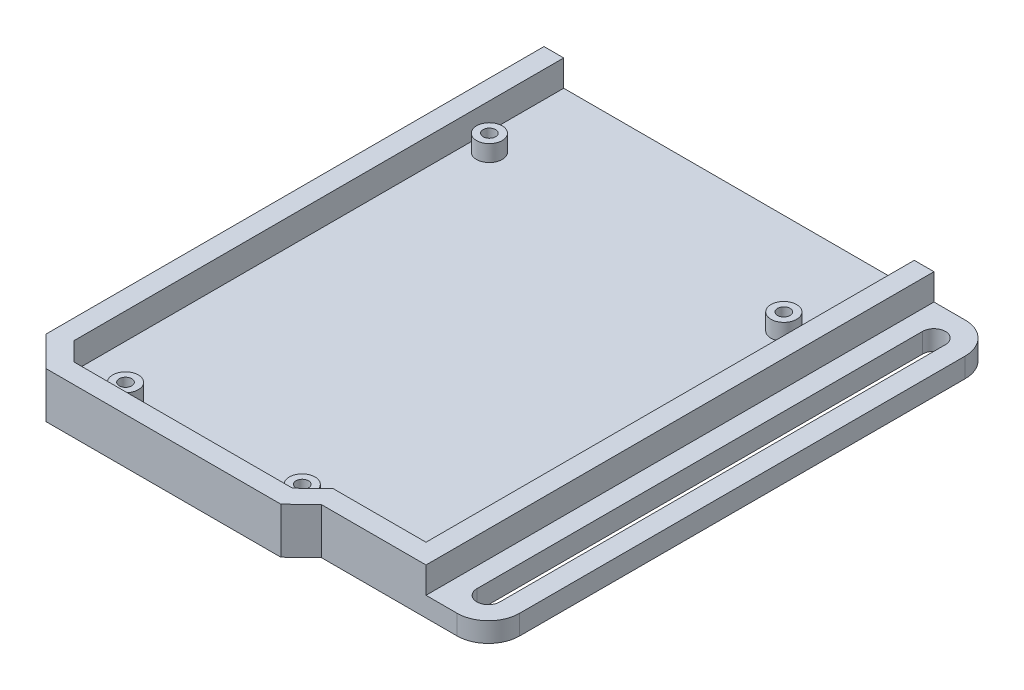
ISO-10303-21;
HEADER;
FILE_DESCRIPTION(('STEP AP214'),'2;1');
FILE_NAME('part.step','',(''),(''),'','','');
FILE_SCHEMA(('AUTOMOTIVE_DESIGN { 1 0 10303 214 1 1 1 1 }'));
ENDSEC;
DATA;
#1=APPLICATION_CONTEXT('core data for automotive mechanical design processes');
#2=APPLICATION_PROTOCOL_DEFINITION('international standard','automotive_design',2000,#1);
#3=PRODUCT_CONTEXT('',#1,'mechanical');
#4=PRODUCT('Part','Part','',(#3));
#5=PRODUCT_RELATED_PRODUCT_CATEGORY('part','',(#4));
#6=PRODUCT_DEFINITION_FORMATION('','',#4);
#7=PRODUCT_DEFINITION_CONTEXT('part definition',#1,'design');
#8=PRODUCT_DEFINITION('design','',#6,#7);
#9=PRODUCT_DEFINITION_SHAPE('','',#8);
#10=(LENGTH_UNIT() NAMED_UNIT(*) SI_UNIT(.MILLI.,.METRE.));
#11=(NAMED_UNIT(*) PLANE_ANGLE_UNIT() SI_UNIT($,.RADIAN.));
#12=(NAMED_UNIT(*) SI_UNIT($,.STERADIAN.) SOLID_ANGLE_UNIT());
#13=UNCERTAINTY_MEASURE_WITH_UNIT(LENGTH_MEASURE(1.E-05),#10,'distance_accuracy_value','');
#14=(GEOMETRIC_REPRESENTATION_CONTEXT(3) GLOBAL_UNCERTAINTY_ASSIGNED_CONTEXT((#13)) GLOBAL_UNIT_ASSIGNED_CONTEXT((#10,
#11,#12)) REPRESENTATION_CONTEXT('',''));
#15=CARTESIAN_POINT('',(0.,0.,0.));
#16=DIRECTION('',(0.,0.,1.));
#17=DIRECTION('',(1.,0.,0.));
#18=AXIS2_PLACEMENT_3D('',#15,#16,#17);
#19=CARTESIAN_POINT('',(0.,3.,0.));
#20=DIRECTION('',(0.,1.,0.));
#21=DIRECTION('',(0.,0.,1.));
#22=AXIS2_PLACEMENT_3D('',#19,#20,#21);
#23=PLANE('',#22);
#24=CARTESIAN_POINT('',(5.76671842937487,3.,14.088511522411));
#25=DIRECTION('',(0.,1.,0.));
#26=DIRECTION('',(0.,0.,1.));
#27=AXIS2_PLACEMENT_3D('',#24,#25,#26);
#28=CIRCLE('',#27,1.95);
#29=CARTESIAN_POINT('',(5.76671842937487,3.,16.038511522411));
#30=VERTEX_POINT('',#29);
#31=EDGE_CURVE('E813',#30,#30,#28,.T.);
#32=ORIENTED_EDGE('',*,*,#31,.F.);
#33=EDGE_LOOP('',(#32));
#34=FACE_BOUND('',#33,.T.);
#35=CARTESIAN_POINT('',(51.762416691101,3.,15.240864439478));
#36=DIRECTION('',(0.,1.,0.));
#37=DIRECTION('',(0.,0.,1.));
#38=AXIS2_PLACEMENT_3D('',#35,#36,#37);
#39=CIRCLE('',#38,1.95);
#40=CARTESIAN_POINT('',(51.762416691101,3.,17.190864439478));
#41=VERTEX_POINT('',#40);
#42=EDGE_CURVE('E819',#41,#41,#39,.T.);
#43=ORIENTED_EDGE('',*,*,#42,.F.);
#44=EDGE_LOOP('',(#43));
#45=FACE_BOUND('',#44,.T.);
#46=CARTESIAN_POINT('',(37.8269628301836,3.,74.6531691166795));
#47=DIRECTION('',(0.,1.,0.));
#48=DIRECTION('',(0.,0.,1.));
#49=AXIS2_PLACEMENT_3D('',#46,#47,#48);
#50=CIRCLE('',#49,1.95);
#51=CARTESIAN_POINT('',(37.8269628301836,3.,76.6031691166795));
#52=VERTEX_POINT('',#51);
#53=EDGE_CURVE('E830',#52,#52,#50,.T.);
#54=ORIENTED_EDGE('',*,*,#53,.F.);
#55=EDGE_LOOP('',(#54));
#56=FACE_BOUND('',#55,.T.);
#57=CARTESIAN_POINT('',(10.9124443508022,3.,74.6531691166795));
#58=DIRECTION('',(0.,1.,0.));
#59=DIRECTION('',(0.,0.,1.));
#60=AXIS2_PLACEMENT_3D('',#57,#58,#59);
#61=CIRCLE('',#60,1.95);
#62=CARTESIAN_POINT('',(10.9124443508022,3.,76.6031691166795));
#63=VERTEX_POINT('',#62);
#64=EDGE_CURVE('E838',#63,#63,#61,.T.);
#65=ORIENTED_EDGE('',*,*,#64,.F.);
#66=EDGE_LOOP('',(#65));
#67=FACE_BOUND('',#66,.T.);
#68=DIRECTION('',(0.,0.,-1.));
#69=VECTOR('',#68,1.);
#70=CARTESIAN_POINT('',(3.,3.,0.));
#71=LINE('',#70,#69);
#72=CARTESIAN_POINT('',(3.,3.,74.6072713686411));
#73=VERTEX_POINT('',#72);
#74=CARTESIAN_POINT('',(3.,3.,0.));
#75=VERTEX_POINT('',#74);
#76=EDGE_CURVE('E56',#73,#75,#71,.T.);
#77=ORIENTED_EDGE('',*,*,#76,.F.);
#78=DIRECTION('',(-0.707106781186547,0.,-0.707106781186548));
#79=VECTOR('',#78,1.);
#80=CARTESIAN_POINT('',(3.,3.,74.6072713686411));
#81=LINE('',#80,#79);
#82=CARTESIAN_POINT('',(5.79289321881343,3.,77.4001645874545));
#83=VERTEX_POINT('',#82);
#84=EDGE_CURVE('E60',#83,#73,#81,.T.);
#85=ORIENTED_EDGE('',*,*,#84,.F.);
#86=DIRECTION('',(-1.,0.,0.));
#87=VECTOR('',#86,1.);
#88=CARTESIAN_POINT('',(5.79289321881343,3.,77.4001645874545));
#89=LINE('',#88,#87);
#90=CARTESIAN_POINT('',(39.1023549197021,3.,77.4001645874545));
#91=VERTEX_POINT('',#90);
#92=EDGE_CURVE('E259',#91,#83,#89,.T.);
#93=ORIENTED_EDGE('',*,*,#92,.F.);
#94=DIRECTION('',(-0.720784855828902,0.,0.693158850197924));
#95=VECTOR('',#94,1.);
#96=CARTESIAN_POINT('',(39.1023549197021,3.,77.4001645874545));
#97=LINE('',#96,#95);
#98=CARTESIAN_POINT('',(42.2577150828608,3.,74.3657420340836));
#99=VERTEX_POINT('',#98);
#100=EDGE_CURVE('E256',#99,#91,#97,.T.);
#101=ORIENTED_EDGE('',*,*,#100,.F.);
#102=DIRECTION('',(-1.,0.,0.));
#103=VECTOR('',#102,1.);
#104=CARTESIAN_POINT('',(42.2577150828608,3.,74.3657420340836));
#105=LINE('',#104,#103);
#106=CARTESIAN_POINT('',(56.3910478037337,3.,74.3657420340836));
#107=VERTEX_POINT('',#106);
#108=EDGE_CURVE('E253',#107,#99,#105,.T.);
#109=ORIENTED_EDGE('',*,*,#108,.F.);
#110=DIRECTION('',(0.,0.,1.));
#111=VECTOR('',#110,1.);
#112=CARTESIAN_POINT('',(56.3910478037337,3.,74.3657420340836));
#113=LINE('',#112,#111);
#114=CARTESIAN_POINT('',(56.3910478037337,3.,0.));
#115=VERTEX_POINT('',#114);
#116=EDGE_CURVE('E249',#115,#107,#113,.T.);
#117=ORIENTED_EDGE('',*,*,#116,.F.);
#118=DIRECTION('',(-1.,0.,0.));
#119=VECTOR('',#118,1.);
#120=CARTESIAN_POINT('',(0.,3.,0.));
#121=LINE('',#120,#119);
#122=EDGE_CURVE('E298',#115,#75,#121,.T.);
#123=ORIENTED_EDGE('',*,*,#122,.T.);
#124=EDGE_LOOP('',(#77,#85,#93,#101,#109,#117,#123));
#125=FACE_BOUND('',#124,.T.);
#126=ADVANCED_FACE('F41',(#34,#45,#56,#67,#125),#23,.T.);
#127=CARTESIAN_POINT('',(64.1410478037337,3.,72.6157420340836));
#128=DIRECTION('',(0.,-1.,0.));
#129=DIRECTION('',(0.,0.,-1.));
#130=AXIS2_PLACEMENT_3D('',#127,#128,#129);
#131=CYLINDRICAL_SURFACE('',#130,1.75);
#132=CARTESIAN_POINT('',(64.1410478037337,0.,72.6157420340836));
#133=DIRECTION('',(0.,1.,0.));
#134=DIRECTION('',(0.,0.,1.));
#135=AXIS2_PLACEMENT_3D('',#132,#133,#134);
#136=CIRCLE('',#135,1.75);
#137=CARTESIAN_POINT('',(62.3910478037337,0.,72.6157420340836));
#138=VERTEX_POINT('',#137);
#139=CARTESIAN_POINT('',(65.8910478037337,0.,72.6157420340836));
#140=VERTEX_POINT('',#139);
#141=EDGE_CURVE('E332',#138,#140,#136,.T.);
#142=ORIENTED_EDGE('',*,*,#141,.F.);
#143=DIRECTION('',(0.,-1.,0.));
#144=VECTOR('',#143,1.);
#145=CARTESIAN_POINT('',(62.3910478037337,3.,72.6157420340836));
#146=LINE('',#145,#144);
#147=CARTESIAN_POINT('',(62.3910478037337,3.,72.6157420340836));
#148=VERTEX_POINT('',#147);
#149=EDGE_CURVE('E350',#148,#138,#146,.T.);
#150=ORIENTED_EDGE('',*,*,#149,.F.);
#151=CARTESIAN_POINT('',(64.1410478037337,3.,72.6157420340836));
#152=DIRECTION('',(0.,1.,0.));
#153=DIRECTION('',(0.,0.,1.));
#154=AXIS2_PLACEMENT_3D('',#151,#152,#153);
#155=CIRCLE('',#154,1.75);
#156=CARTESIAN_POINT('',(65.8910478037337,3.,72.6157420340836));
#157=VERTEX_POINT('',#156);
#158=EDGE_CURVE('E301',#148,#157,#155,.T.);
#159=ORIENTED_EDGE('',*,*,#158,.T.);
#160=DIRECTION('',(0.,-1.,0.));
#161=VECTOR('',#160,1.);
#162=CARTESIAN_POINT('',(65.8910478037337,3.,72.6157420340836));
#163=LINE('',#162,#161);
#164=EDGE_CURVE('E343',#157,#140,#163,.T.);
#165=ORIENTED_EDGE('',*,*,#164,.T.);
#166=EDGE_LOOP('',(#142,#150,#159,#165));
#167=FACE_BOUND('',#166,.T.);
#168=ADVANCED_FACE('F406',(#167),#131,.F.);
#169=CARTESIAN_POINT('',(62.3910478037337,3.,0.));
#170=DIRECTION('',(1.,0.,0.));
#171=DIRECTION('',(0.,0.,-1.));
#172=AXIS2_PLACEMENT_3D('',#169,#170,#171);
#173=PLANE('',#172);
#174=DIRECTION('',(0.,0.,1.));
#175=VECTOR('',#174,1.);
#176=CARTESIAN_POINT('',(62.3910478037337,0.,0.));
#177=LINE('',#176,#175);
#178=CARTESIAN_POINT('',(62.3910478037337,0.,4.75000000000003));
#179=VERTEX_POINT('',#178);
#180=EDGE_CURVE('E335',#179,#138,#177,.T.);
#181=ORIENTED_EDGE('',*,*,#180,.F.);
#182=DIRECTION('',(0.,-1.,0.));
#183=VECTOR('',#182,1.);
#184=CARTESIAN_POINT('',(62.3910478037337,3.,4.75000000000003));
#185=LINE('',#184,#183);
#186=CARTESIAN_POINT('',(62.3910478037337,3.,4.75000000000003));
#187=VERTEX_POINT('',#186);
#188=EDGE_CURVE('E348',#187,#179,#185,.T.);
#189=ORIENTED_EDGE('',*,*,#188,.F.);
#190=DIRECTION('',(0.,0.,1.));
#191=VECTOR('',#190,1.);
#192=CARTESIAN_POINT('',(62.3910478037337,3.,0.));
#193=LINE('',#192,#191);
#194=EDGE_CURVE('E304',#187,#148,#193,.T.);
#195=ORIENTED_EDGE('',*,*,#194,.T.);
#196=ORIENTED_EDGE('',*,*,#149,.T.);
#197=EDGE_LOOP('',(#181,#189,#195,#196));
#198=FACE_BOUND('',#197,.T.);
#199=ADVANCED_FACE('F413',(#198),#173,.T.);
#200=CARTESIAN_POINT('',(64.1410478037337,3.,4.75000000000003));
#201=DIRECTION('',(0.,-1.,0.));
#202=DIRECTION('',(0.,0.,-1.));
#203=AXIS2_PLACEMENT_3D('',#200,#201,#202);
#204=CYLINDRICAL_SURFACE('',#203,1.75);
#205=CARTESIAN_POINT('',(64.1410478037337,0.,4.75000000000003));
#206=DIRECTION('',(0.,1.,0.));
#207=DIRECTION('',(0.,0.,1.));
#208=AXIS2_PLACEMENT_3D('',#205,#206,#207);
#209=CIRCLE('',#208,1.75);
#210=CARTESIAN_POINT('',(65.8910478037337,0.,4.75000000000003));
#211=VERTEX_POINT('',#210);
#212=EDGE_CURVE('E338',#211,#179,#209,.T.);
#213=ORIENTED_EDGE('',*,*,#212,.F.);
#214=DIRECTION('',(0.,-1.,0.));
#215=VECTOR('',#214,1.);
#216=CARTESIAN_POINT('',(65.8910478037337,3.,4.75000000000003));
#217=LINE('',#216,#215);
#218=CARTESIAN_POINT('',(65.8910478037337,3.,4.75000000000003));
#219=VERTEX_POINT('',#218);
#220=EDGE_CURVE('E345',#219,#211,#217,.T.);
#221=ORIENTED_EDGE('',*,*,#220,.F.);
#222=CARTESIAN_POINT('',(64.1410478037337,3.,4.75000000000003));
#223=DIRECTION('',(0.,1.,0.));
#224=DIRECTION('',(0.,0.,1.));
#225=AXIS2_PLACEMENT_3D('',#222,#223,#224);
#226=CIRCLE('',#225,1.75);
#227=EDGE_CURVE('E307',#219,#187,#226,.T.);
#228=ORIENTED_EDGE('',*,*,#227,.T.);
#229=ORIENTED_EDGE('',*,*,#188,.T.);
#230=EDGE_LOOP('',(#213,#221,#228,#229));
#231=FACE_BOUND('',#230,.T.);
#232=ADVANCED_FACE('F543',(#231),#204,.F.);
#233=CARTESIAN_POINT('',(0.,3.,77.3657420340836));
#234=DIRECTION('',(0.,0.,-1.));
#235=DIRECTION('',(-1.,0.,0.));
#236=AXIS2_PLACEMENT_3D('',#233,#234,#235);
#237=PLANE('',#236);
#238=DIRECTION('',(1.,0.,0.));
#239=VECTOR('',#238,1.);
#240=CARTESIAN_POINT('',(0.,0.,77.3657420340836));
#241=LINE('',#240,#239);
#242=CARTESIAN_POINT('',(43.4661616492923,0.,77.3657420340836));
#243=VERTEX_POINT('',#242);
#244=CARTESIAN_POINT('',(64.1410478037337,0.,77.3657420340836));
#245=VERTEX_POINT('',#244);
#246=EDGE_CURVE('E287',#243,#245,#241,.T.);
#247=ORIENTED_EDGE('',*,*,#246,.T.);
#248=DIRECTION('',(0.,-1.,0.));
#249=VECTOR('',#248,1.);
#250=CARTESIAN_POINT('',(64.1410478037337,3.,77.3657420340836));
#251=LINE('',#250,#249);
#252=CARTESIAN_POINT('',(64.1410478037337,3.,77.3657420340836));
#253=VERTEX_POINT('',#252);
#254=EDGE_CURVE('E346',#253,#245,#251,.T.);
#255=ORIENTED_EDGE('',*,*,#254,.F.);
#256=DIRECTION('',(1.,0.,0.));
#257=VECTOR('',#256,1.);
#258=CARTESIAN_POINT('',(0.,3.,77.3657420340836));
#259=LINE('',#258,#257);
#260=CARTESIAN_POINT('',(59.3910478037337,3.,77.3657420340836));
#261=VERTEX_POINT('',#260);
#262=EDGE_CURVE('E288',#261,#253,#259,.T.);
#263=ORIENTED_EDGE('',*,*,#262,.F.);
#264=DIRECTION('',(0.,-1.,0.));
#265=VECTOR('',#264,1.);
#266=CARTESIAN_POINT('',(59.3910478037337,7.,77.3657420340836));
#267=LINE('',#266,#265);
#268=CARTESIAN_POINT('',(59.3910478037337,7.,77.3657420340836));
#269=VERTEX_POINT('',#268);
#270=EDGE_CURVE('E284',#269,#261,#267,.T.);
#271=ORIENTED_EDGE('',*,*,#270,.F.);
#272=DIRECTION('',(1.,0.,0.));
#273=VECTOR('',#272,1.);
#274=CARTESIAN_POINT('',(43.4661616492923,7.,77.3657420340836));
#275=LINE('',#274,#273);
#276=CARTESIAN_POINT('',(43.4661616492923,7.,77.3657420340836));
#277=VERTEX_POINT('',#276);
#278=EDGE_CURVE('E228',#277,#269,#275,.T.);
#279=ORIENTED_EDGE('',*,*,#278,.F.);
#280=DIRECTION('',(0.,-1.,0.));
#281=VECTOR('',#280,1.);
#282=CARTESIAN_POINT('',(43.4661616492923,3.,77.3657420340836));
#283=LINE('',#282,#281);
#284=EDGE_CURVE('E312',#277,#243,#283,.T.);
#285=ORIENTED_EDGE('',*,*,#284,.T.);
#286=EDGE_LOOP('',(#247,#255,#263,#271,#279,#285));
#287=FACE_BOUND('',#286,.T.);
#288=ADVANCED_FACE('F43',(#287),#237,.F.);
#289=CARTESIAN_POINT('',(64.1410478037337,3.,72.6157420340836));
#290=DIRECTION('',(0.,-1.,0.));
#291=DIRECTION('',(0.,0.,-1.));
#292=AXIS2_PLACEMENT_3D('',#289,#290,#291);
#293=CYLINDRICAL_SURFACE('',#292,4.75);
#294=CARTESIAN_POINT('',(64.1410478037337,0.,72.6157420340836));
#295=DIRECTION('',(0.,1.,0.));
#296=DIRECTION('',(0.,0.,1.));
#297=AXIS2_PLACEMENT_3D('',#294,#295,#296);
#298=CIRCLE('',#297,4.75);
#299=CARTESIAN_POINT('',(68.8910478037337,0.,72.6157420340836));
#300=VERTEX_POINT('',#299);
#301=EDGE_CURVE('E315',#245,#300,#298,.T.);
#302=ORIENTED_EDGE('',*,*,#301,.T.);
#303=DIRECTION('',(0.,-1.,0.));
#304=VECTOR('',#303,1.);
#305=CARTESIAN_POINT('',(68.8910478037337,3.,72.6157420340836));
#306=LINE('',#305,#304);
#307=CARTESIAN_POINT('',(68.8910478037337,3.,72.6157420340836));
#308=VERTEX_POINT('',#307);
#309=EDGE_CURVE('E365',#308,#300,#306,.T.);
#310=ORIENTED_EDGE('',*,*,#309,.F.);
#311=CARTESIAN_POINT('',(64.1410478037337,3.,72.6157420340836));
#312=DIRECTION('',(0.,1.,0.));
#313=DIRECTION('',(0.,0.,1.));
#314=AXIS2_PLACEMENT_3D('',#311,#312,#313);
#315=CIRCLE('',#314,4.75);
#316=EDGE_CURVE('E290',#253,#308,#315,.T.);
#317=ORIENTED_EDGE('',*,*,#316,.F.);
#318=ORIENTED_EDGE('',*,*,#254,.T.);
#319=EDGE_LOOP('',(#302,#310,#317,#318));
#320=FACE_BOUND('',#319,.T.);
#321=ADVANCED_FACE('F497',(#320),#293,.T.);
#322=CARTESIAN_POINT('',(68.8910478037337,3.,0.));
#323=DIRECTION('',(1.,0.,0.));
#324=DIRECTION('',(0.,0.,-1.));
#325=AXIS2_PLACEMENT_3D('',#322,#323,#324);
#326=PLANE('',#325);
#327=DIRECTION('',(0.,0.,1.));
#328=VECTOR('',#327,1.);
#329=CARTESIAN_POINT('',(68.8910478037337,0.,0.));
#330=LINE('',#329,#328);
#331=CARTESIAN_POINT('',(68.8910478037337,0.,4.75000000000003));
#332=VERTEX_POINT('',#331);
#333=EDGE_CURVE('E318',#332,#300,#330,.T.);
#334=ORIENTED_EDGE('',*,*,#333,.F.);
#335=DIRECTION('',(0.,-1.,0.));
#336=VECTOR('',#335,1.);
#337=CARTESIAN_POINT('',(68.8910478037337,3.,4.75000000000003));
#338=LINE('',#337,#336);
#339=CARTESIAN_POINT('',(68.8910478037337,3.,4.75000000000003));
#340=VERTEX_POINT('',#339);
#341=EDGE_CURVE('E363',#340,#332,#338,.T.);
#342=ORIENTED_EDGE('',*,*,#341,.F.);
#343=DIRECTION('',(0.,0.,1.));
#344=VECTOR('',#343,1.);
#345=CARTESIAN_POINT('',(68.8910478037337,3.,0.));
#346=LINE('',#345,#344);
#347=EDGE_CURVE('E293',#340,#308,#346,.T.);
#348=ORIENTED_EDGE('',*,*,#347,.T.);
#349=ORIENTED_EDGE('',*,*,#309,.T.);
#350=EDGE_LOOP('',(#334,#342,#348,#349));
#351=FACE_BOUND('',#350,.T.);
#352=ADVANCED_FACE('F500',(#351),#326,.T.);
#353=CARTESIAN_POINT('',(64.1410478037337,3.,4.75000000000003));
#354=DIRECTION('',(0.,-1.,0.));
#355=DIRECTION('',(0.,0.,-1.));
#356=AXIS2_PLACEMENT_3D('',#353,#354,#355);
#357=CYLINDRICAL_SURFACE('',#356,4.75);
#358=CARTESIAN_POINT('',(64.1410478037337,0.,4.75000000000003));
#359=DIRECTION('',(0.,1.,0.));
#360=DIRECTION('',(0.,0.,1.));
#361=AXIS2_PLACEMENT_3D('',#358,#359,#360);
#362=CIRCLE('',#361,4.75);
#363=CARTESIAN_POINT('',(64.1410478037337,0.,0.));
#364=VERTEX_POINT('',#363);
#365=EDGE_CURVE('E321',#332,#364,#362,.T.);
#366=ORIENTED_EDGE('',*,*,#365,.T.);
#367=DIRECTION('',(0.,-1.,0.));
#368=VECTOR('',#367,1.);
#369=CARTESIAN_POINT('',(64.1410478037337,3.,0.));
#370=LINE('',#369,#368);
#371=CARTESIAN_POINT('',(64.1410478037337,3.,0.));
#372=VERTEX_POINT('',#371);
#373=EDGE_CURVE('E199',#372,#364,#370,.T.);
#374=ORIENTED_EDGE('',*,*,#373,.F.);
#375=CARTESIAN_POINT('',(64.1410478037337,3.,4.75000000000003));
#376=DIRECTION('',(0.,1.,0.));
#377=DIRECTION('',(0.,0.,1.));
#378=AXIS2_PLACEMENT_3D('',#375,#376,#377);
#379=CIRCLE('',#378,4.75);
#380=EDGE_CURVE('E296',#340,#372,#379,.T.);
#381=ORIENTED_EDGE('',*,*,#380,.F.);
#382=ORIENTED_EDGE('',*,*,#341,.T.);
#383=EDGE_LOOP('',(#366,#374,#381,#382));
#384=FACE_BOUND('',#383,.T.);
#385=ADVANCED_FACE('F504',(#384),#357,.T.);
#386=CARTESIAN_POINT('',(0.,3.,0.));
#387=DIRECTION('',(0.,0.,1.));
#388=DIRECTION('',(1.,0.,0.));
#389=AXIS2_PLACEMENT_3D('',#386,#387,#388);
#390=PLANE('',#389);
#391=DIRECTION('',(-1.,0.,0.));
#392=VECTOR('',#391,1.);
#393=CARTESIAN_POINT('',(0.,0.,0.));
#394=LINE('',#393,#392);
#395=CARTESIAN_POINT('',(0.,0.,0.));
#396=VERTEX_POINT('',#395);
#397=EDGE_CURVE('E196',#364,#396,#394,.T.);
#398=ORIENTED_EDGE('',*,*,#397,.T.);
#399=DIRECTION('',(0.,-1.,0.));
#400=VECTOR('',#399,1.);
#401=CARTESIAN_POINT('',(0.,3.,0.));
#402=LINE('',#401,#400);
#403=CARTESIAN_POINT('',(0.,7.,0.));
#404=VERTEX_POINT('',#403);
#405=EDGE_CURVE('E188',#404,#396,#402,.T.);
#406=ORIENTED_EDGE('',*,*,#405,.F.);
#407=DIRECTION('',(-1.,0.,0.));
#408=VECTOR('',#407,1.);
#409=CARTESIAN_POINT('',(0.,7.,0.));
#410=LINE('',#409,#408);
#411=CARTESIAN_POINT('',(3.,7.,0.));
#412=VERTEX_POINT('',#411);
#413=EDGE_CURVE('E193',#412,#404,#410,.T.);
#414=ORIENTED_EDGE('',*,*,#413,.F.);
#415=DIRECTION('',(0.,-1.,0.));
#416=VECTOR('',#415,1.);
#417=CARTESIAN_POINT('',(3.,7.,0.));
#418=LINE('',#417,#416);
#419=EDGE_CURVE('E245',#412,#75,#418,.T.);
#420=ORIENTED_EDGE('',*,*,#419,.T.);
#421=ORIENTED_EDGE('',*,*,#122,.F.);
#422=DIRECTION('',(0.,-1.,0.));
#423=VECTOR('',#422,1.);
#424=CARTESIAN_POINT('',(56.3910478037337,7.,0.));
#425=LINE('',#424,#423);
#426=CARTESIAN_POINT('',(56.3910478037337,7.,0.));
#427=VERTEX_POINT('',#426);
#428=EDGE_CURVE('E278',#427,#115,#425,.T.);
#429=ORIENTED_EDGE('',*,*,#428,.F.);
#430=DIRECTION('',(-1.,0.,0.));
#431=VECTOR('',#430,1.);
#432=CARTESIAN_POINT('',(59.3910478037337,7.,0.));
#433=LINE('',#432,#431);
#434=CARTESIAN_POINT('',(59.3910478037337,7.,0.));
#435=VERTEX_POINT('',#434);
#436=EDGE_CURVE('E232',#435,#427,#433,.T.);
#437=ORIENTED_EDGE('',*,*,#436,.F.);
#438=DIRECTION('',(0.,-1.,0.));
#439=VECTOR('',#438,1.);
#440=CARTESIAN_POINT('',(59.3910478037337,7.,0.));
#441=LINE('',#440,#439);
#442=CARTESIAN_POINT('',(59.3910478037337,3.,0.));
#443=VERTEX_POINT('',#442);
#444=EDGE_CURVE('E281',#435,#443,#441,.T.);
#445=ORIENTED_EDGE('',*,*,#444,.T.);
#446=EDGE_CURVE('E299',#372,#443,#121,.T.);
#447=ORIENTED_EDGE('',*,*,#446,.F.);
#448=ORIENTED_EDGE('',*,*,#373,.T.);
#449=EDGE_LOOP('',(#398,#406,#414,#420,#421,#429,#437,#445,#447,#448));
#450=FACE_BOUND('',#449,.T.);
#451=ADVANCED_FACE('F190',(#450),#390,.F.);
#452=CARTESIAN_POINT('',(0.,3.,0.));
#453=DIRECTION('',(1.,0.,0.));
#454=DIRECTION('',(0.,0.,-1.));
#455=AXIS2_PLACEMENT_3D('',#452,#453,#454);
#456=PLANE('',#455);
#457=DIRECTION('',(0.,0.,1.));
#458=VECTOR('',#457,1.);
#459=CARTESIAN_POINT('',(0.,0.,0.));
#460=LINE('',#459,#458);
#461=CARTESIAN_POINT('',(0.,0.,75.8499120557604));
#462=VERTEX_POINT('',#461);
#463=EDGE_CURVE('E324',#396,#462,#460,.T.);
#464=ORIENTED_EDGE('',*,*,#463,.T.);
#465=DIRECTION('',(0.,-1.,0.));
#466=VECTOR('',#465,1.);
#467=CARTESIAN_POINT('',(0.,3.,75.8499120557604));
#468=LINE('',#467,#466);
#469=CARTESIAN_POINT('',(0.,7.,75.8499120557604));
#470=VERTEX_POINT('',#469);
#471=EDGE_CURVE('E200',#470,#462,#468,.T.);
#472=ORIENTED_EDGE('',*,*,#471,.F.);
#473=DIRECTION('',(0.,0.,1.));
#474=VECTOR('',#473,1.);
#475=CARTESIAN_POINT('',(0.,7.,0.));
#476=LINE('',#475,#474);
#477=EDGE_CURVE('E203',#404,#470,#476,.T.);
#478=ORIENTED_EDGE('',*,*,#477,.F.);
#479=ORIENTED_EDGE('',*,*,#405,.T.);
#480=EDGE_LOOP('',(#464,#472,#478,#479));
#481=FACE_BOUND('',#480,.T.);
#482=ADVANCED_FACE('F204',(#481),#456,.F.);
#483=CARTESIAN_POINT('',(-37.9249560278802,3.,37.9249560278803));
#484=DIRECTION('',(0.707106781186547,0.,-0.707106781186548));
#485=DIRECTION('',(-0.707106781186548,0.,-0.707106781186547));
#486=AXIS2_PLACEMENT_3D('',#483,#484,#485);
#487=PLANE('',#486);
#488=DIRECTION('',(0.707106781186548,0.,0.707106781186547));
#489=VECTOR('',#488,1.);
#490=CARTESIAN_POINT('',(-37.9249560278802,0.,37.9249560278803));
#491=LINE('',#490,#489);
#492=CARTESIAN_POINT('',(4.55025253169415,0.,80.4001645874545));
#493=VERTEX_POINT('',#492);
#494=EDGE_CURVE('E326',#462,#493,#491,.T.);
#495=ORIENTED_EDGE('',*,*,#494,.T.);
#496=DIRECTION('',(0.,-1.,0.));
#497=VECTOR('',#496,1.);
#498=CARTESIAN_POINT('',(4.55025253169415,3.,80.4001645874545));
#499=LINE('',#498,#497);
#500=CARTESIAN_POINT('',(4.55025253169415,7.,80.4001645874545));
#501=VERTEX_POINT('',#500);
#502=EDGE_CURVE('E358',#501,#493,#499,.T.);
#503=ORIENTED_EDGE('',*,*,#502,.F.);
#504=DIRECTION('',(0.707106781186548,0.,0.707106781186547));
#505=VECTOR('',#504,1.);
#506=CARTESIAN_POINT('',(0.,7.,75.8499120557604));
#507=LINE('',#506,#505);
#508=EDGE_CURVE('E209',#470,#501,#507,.T.);
#509=ORIENTED_EDGE('',*,*,#508,.F.);
#510=ORIENTED_EDGE('',*,*,#471,.T.);
#511=EDGE_LOOP('',(#495,#503,#509,#510));
#512=FACE_BOUND('',#511,.T.);
#513=ADVANCED_FACE('F511',(#512),#487,.F.);
#514=CARTESIAN_POINT('',(0.,3.,80.4001645874545));
#515=DIRECTION('',(0.,0.,-1.));
#516=DIRECTION('',(-1.,0.,0.));
#517=AXIS2_PLACEMENT_3D('',#514,#515,#516);
#518=PLANE('',#517);
#519=DIRECTION('',(1.,0.,0.));
#520=VECTOR('',#519,1.);
#521=CARTESIAN_POINT('',(0.,0.,80.4001645874545));
#522=LINE('',#521,#520);
#523=CARTESIAN_POINT('',(40.3108014861336,0.,80.4001645874545));
#524=VERTEX_POINT('',#523);
#525=EDGE_CURVE('E328',#493,#524,#522,.T.);
#526=ORIENTED_EDGE('',*,*,#525,.T.);
#527=DIRECTION('',(0.,-1.,0.));
#528=VECTOR('',#527,1.);
#529=CARTESIAN_POINT('',(40.3108014861336,3.,80.4001645874545));
#530=LINE('',#529,#528);
#531=CARTESIAN_POINT('',(40.3108014861336,7.,80.4001645874545));
#532=VERTEX_POINT('',#531);
#533=EDGE_CURVE('E355',#532,#524,#530,.T.);
#534=ORIENTED_EDGE('',*,*,#533,.F.);
#535=DIRECTION('',(1.,0.,0.));
#536=VECTOR('',#535,1.);
#537=CARTESIAN_POINT('',(4.55025253169415,7.,80.4001645874545));
#538=LINE('',#537,#536);
#539=EDGE_CURVE('E222',#501,#532,#538,.T.);
#540=ORIENTED_EDGE('',*,*,#539,.F.);
#541=ORIENTED_EDGE('',*,*,#502,.T.);
#542=EDGE_LOOP('',(#526,#534,#540,#541));
#543=FACE_BOUND('',#542,.T.);
#544=ADVANCED_FACE('F514',(#543),#518,.F.);
#545=CARTESIAN_POINT('',(59.5374999473001,3.,61.9103807210633));
#546=DIRECTION('',(-0.693158850197924,0.,-0.720784855828902));
#547=DIRECTION('',(-0.720784855828902,0.,0.693158850197924));
#548=AXIS2_PLACEMENT_3D('',#545,#546,#547);
#549=PLANE('',#548);
#550=DIRECTION('',(0.720784855828902,0.,-0.693158850197924));
#551=VECTOR('',#550,1.);
#552=CARTESIAN_POINT('',(59.5374999473001,0.,61.9103807210633));
#553=LINE('',#552,#551);
#554=EDGE_CURVE('E330',#524,#243,#553,.T.);
#555=ORIENTED_EDGE('',*,*,#554,.T.);
#556=ORIENTED_EDGE('',*,*,#284,.F.);
#557=DIRECTION('',(0.720784855828902,0.,-0.693158850197924));
#558=VECTOR('',#557,1.);
#559=CARTESIAN_POINT('',(40.3108014861336,7.,80.4001645874545));
#560=LINE('',#559,#558);
#561=EDGE_CURVE('E225',#532,#277,#560,.T.);
#562=ORIENTED_EDGE('',*,*,#561,.F.);
#563=ORIENTED_EDGE('',*,*,#533,.T.);
#564=EDGE_LOOP('',(#555,#556,#562,#563));
#565=FACE_BOUND('',#564,.T.);
#566=ADVANCED_FACE('F517',(#565),#549,.F.);
#567=CARTESIAN_POINT('',(65.8910478037337,3.,0.));
#568=DIRECTION('',(1.,0.,0.));
#569=DIRECTION('',(0.,0.,-1.));
#570=AXIS2_PLACEMENT_3D('',#567,#568,#569);
#571=PLANE('',#570);
#572=DIRECTION('',(0.,0.,1.));
#573=VECTOR('',#572,1.);
#574=CARTESIAN_POINT('',(65.8910478037337,0.,0.));
#575=LINE('',#574,#573);
#576=EDGE_CURVE('E291',#211,#140,#575,.T.);
#577=ORIENTED_EDGE('',*,*,#576,.T.);
#578=ORIENTED_EDGE('',*,*,#164,.F.);
#579=DIRECTION('',(0.,0.,1.));
#580=VECTOR('',#579,1.);
#581=CARTESIAN_POINT('',(65.8910478037337,3.,0.));
#582=LINE('',#581,#580);
#583=EDGE_CURVE('E310',#219,#157,#582,.T.);
#584=ORIENTED_EDGE('',*,*,#583,.F.);
#585=ORIENTED_EDGE('',*,*,#220,.T.);
#586=EDGE_LOOP('',(#577,#578,#584,#585));
#587=FACE_BOUND('',#586,.T.);
#588=ADVANCED_FACE('F420',(#587),#571,.F.);
#589=DIRECTION('',(0.,0.,-1.));
#590=VECTOR('',#589,1.);
#591=CARTESIAN_POINT('',(59.3910478037337,3.,77.3657420340836));
#592=LINE('',#591,#590);
#593=EDGE_CURVE('E246',#261,#443,#592,.T.);
#594=ORIENTED_EDGE('',*,*,#593,.F.);
#595=ORIENTED_EDGE('',*,*,#262,.T.);
#596=ORIENTED_EDGE('',*,*,#316,.T.);
#597=ORIENTED_EDGE('',*,*,#347,.F.);
#598=ORIENTED_EDGE('',*,*,#380,.T.);
#599=ORIENTED_EDGE('',*,*,#446,.T.);
#600=EDGE_LOOP('',(#594,#595,#596,#597,#598,#599));
#601=FACE_BOUND('',#600,.T.);
#602=ORIENTED_EDGE('',*,*,#158,.F.);
#603=ORIENTED_EDGE('',*,*,#194,.F.);
#604=ORIENTED_EDGE('',*,*,#227,.F.);
#605=ORIENTED_EDGE('',*,*,#583,.T.);
#606=EDGE_LOOP('',(#602,#603,#604,#605));
#607=FACE_BOUND('',#606,.T.);
#608=ADVANCED_FACE('F394',(#601,#607),#23,.T.);
#609=CARTESIAN_POINT('',(0.,0.,0.));
#610=DIRECTION('',(0.,1.,0.));
#611=DIRECTION('',(0.,0.,1.));
#612=AXIS2_PLACEMENT_3D('',#609,#610,#611);
#613=PLANE('',#612);
#614=ORIENTED_EDGE('',*,*,#246,.F.);
#615=ORIENTED_EDGE('',*,*,#554,.F.);
#616=ORIENTED_EDGE('',*,*,#525,.F.);
#617=ORIENTED_EDGE('',*,*,#494,.F.);
#618=ORIENTED_EDGE('',*,*,#463,.F.);
#619=ORIENTED_EDGE('',*,*,#397,.F.);
#620=ORIENTED_EDGE('',*,*,#365,.F.);
#621=ORIENTED_EDGE('',*,*,#333,.T.);
#622=ORIENTED_EDGE('',*,*,#301,.F.);
#623=EDGE_LOOP('',(#614,#615,#616,#617,#618,#619,#620,#621,#622));
#624=FACE_BOUND('',#623,.T.);
#625=ORIENTED_EDGE('',*,*,#141,.T.);
#626=ORIENTED_EDGE('',*,*,#576,.F.);
#627=ORIENTED_EDGE('',*,*,#212,.T.);
#628=ORIENTED_EDGE('',*,*,#180,.T.);
#629=EDGE_LOOP('',(#625,#626,#627,#628));
#630=FACE_BOUND('',#629,.T.);
#631=ADVANCED_FACE('F419',(#624,#630),#613,.F.);
#632=CARTESIAN_POINT('',(59.3910478037337,7.,77.3657420340836));
#633=DIRECTION('',(-1.,0.,0.));
#634=DIRECTION('',(0.,0.,1.));
#635=AXIS2_PLACEMENT_3D('',#632,#633,#634);
#636=PLANE('',#635);
#637=ORIENTED_EDGE('',*,*,#593,.T.);
#638=ORIENTED_EDGE('',*,*,#444,.F.);
#639=DIRECTION('',(0.,0.,-1.));
#640=VECTOR('',#639,1.);
#641=CARTESIAN_POINT('',(59.3910478037337,7.,77.3657420340836));
#642=LINE('',#641,#640);
#643=EDGE_CURVE('E230',#269,#435,#642,.T.);
#644=ORIENTED_EDGE('',*,*,#643,.F.);
#645=ORIENTED_EDGE('',*,*,#270,.T.);
#646=EDGE_LOOP('',(#637,#638,#644,#645));
#647=FACE_BOUND('',#646,.T.);
#648=ADVANCED_FACE('F470',(#647),#636,.F.);
#649=CARTESIAN_POINT('',(56.3910478037337,7.,74.3657420340836));
#650=DIRECTION('',(1.,0.,0.));
#651=DIRECTION('',(0.,0.,-1.));
#652=AXIS2_PLACEMENT_3D('',#649,#650,#651);
#653=PLANE('',#652);
#654=ORIENTED_EDGE('',*,*,#116,.T.);
#655=DIRECTION('',(0.,-1.,0.));
#656=VECTOR('',#655,1.);
#657=CARTESIAN_POINT('',(56.3910478037337,7.,74.3657420340836));
#658=LINE('',#657,#656);
#659=CARTESIAN_POINT('',(56.3910478037337,7.,74.3657420340836));
#660=VERTEX_POINT('',#659);
#661=EDGE_CURVE('E275',#660,#107,#658,.T.);
#662=ORIENTED_EDGE('',*,*,#661,.F.);
#663=DIRECTION('',(0.,0.,1.));
#664=VECTOR('',#663,1.);
#665=CARTESIAN_POINT('',(56.3910478037337,7.,74.3657420340836));
#666=LINE('',#665,#664);
#667=EDGE_CURVE('E234',#427,#660,#666,.T.);
#668=ORIENTED_EDGE('',*,*,#667,.F.);
#669=ORIENTED_EDGE('',*,*,#428,.T.);
#670=EDGE_LOOP('',(#654,#662,#668,#669));
#671=FACE_BOUND('',#670,.T.);
#672=ADVANCED_FACE('F467',(#671),#653,.F.);
#673=CARTESIAN_POINT('',(42.2577150828608,7.,74.3657420340836));
#674=DIRECTION('',(0.,0.,1.));
#675=DIRECTION('',(1.,0.,0.));
#676=AXIS2_PLACEMENT_3D('',#673,#674,#675);
#677=PLANE('',#676);
#678=ORIENTED_EDGE('',*,*,#108,.T.);
#679=DIRECTION('',(0.,-1.,0.));
#680=VECTOR('',#679,1.);
#681=CARTESIAN_POINT('',(42.2577150828608,7.,74.3657420340836));
#682=LINE('',#681,#680);
#683=CARTESIAN_POINT('',(42.2577150828608,7.,74.3657420340836));
#684=VERTEX_POINT('',#683);
#685=EDGE_CURVE('E272',#684,#99,#682,.T.);
#686=ORIENTED_EDGE('',*,*,#685,.F.);
#687=DIRECTION('',(-1.,0.,0.));
#688=VECTOR('',#687,1.);
#689=CARTESIAN_POINT('',(42.2577150828608,7.,74.3657420340836));
#690=LINE('',#689,#688);
#691=EDGE_CURVE('E236',#660,#684,#690,.T.);
#692=ORIENTED_EDGE('',*,*,#691,.F.);
#693=ORIENTED_EDGE('',*,*,#661,.T.);
#694=EDGE_LOOP('',(#678,#686,#692,#693));
#695=FACE_BOUND('',#694,.T.);
#696=ADVANCED_FACE('F463',(#695),#677,.F.);
#697=CARTESIAN_POINT('',(39.1023549197021,7.,77.4001645874545));
#698=DIRECTION('',(0.693158850197925,0.,0.720784855828902));
#699=DIRECTION('',(0.720784855828902,0.,-0.693158850197924));
#700=AXIS2_PLACEMENT_3D('',#697,#698,#699);
#701=PLANE('',#700);
#702=ORIENTED_EDGE('',*,*,#100,.T.);
#703=DIRECTION('',(0.,-1.,0.));
#704=VECTOR('',#703,1.);
#705=CARTESIAN_POINT('',(39.1023549197021,7.,77.4001645874545));
#706=LINE('',#705,#704);
#707=CARTESIAN_POINT('',(39.1023549197021,7.,77.4001645874545));
#708=VERTEX_POINT('',#707);
#709=EDGE_CURVE('E269',#708,#91,#706,.T.);
#710=ORIENTED_EDGE('',*,*,#709,.F.);
#711=DIRECTION('',(-0.720784855828902,0.,0.693158850197924));
#712=VECTOR('',#711,1.);
#713=CARTESIAN_POINT('',(39.1023549197021,7.,77.4001645874545));
#714=LINE('',#713,#712);
#715=EDGE_CURVE('E238',#684,#708,#714,.T.);
#716=ORIENTED_EDGE('',*,*,#715,.F.);
#717=ORIENTED_EDGE('',*,*,#685,.T.);
#718=EDGE_LOOP('',(#702,#710,#716,#717));
#719=FACE_BOUND('',#718,.T.);
#720=ADVANCED_FACE('F459',(#719),#701,.F.);
#721=CARTESIAN_POINT('',(5.79289321881343,7.,77.4001645874545));
#722=DIRECTION('',(0.,0.,1.));
#723=DIRECTION('',(1.,0.,0.));
#724=AXIS2_PLACEMENT_3D('',#721,#722,#723);
#725=PLANE('',#724);
#726=ORIENTED_EDGE('',*,*,#92,.T.);
#727=DIRECTION('',(0.,-1.,0.));
#728=VECTOR('',#727,1.);
#729=CARTESIAN_POINT('',(5.79289321881343,7.,77.4001645874545));
#730=LINE('',#729,#728);
#731=CARTESIAN_POINT('',(5.79289321881343,7.,77.4001645874545));
#732=VERTEX_POINT('',#731);
#733=EDGE_CURVE('E266',#732,#83,#730,.T.);
#734=ORIENTED_EDGE('',*,*,#733,.F.);
#735=DIRECTION('',(-1.,0.,0.));
#736=VECTOR('',#735,1.);
#737=CARTESIAN_POINT('',(5.79289321881343,7.,77.4001645874545));
#738=LINE('',#737,#736);
#739=EDGE_CURVE('E240',#708,#732,#738,.T.);
#740=ORIENTED_EDGE('',*,*,#739,.F.);
#741=ORIENTED_EDGE('',*,*,#709,.T.);
#742=EDGE_LOOP('',(#726,#734,#740,#741));
#743=FACE_BOUND('',#742,.T.);
#744=ADVANCED_FACE('F455',(#743),#725,.F.);
#745=CARTESIAN_POINT('',(3.,7.,74.6072713686411));
#746=DIRECTION('',(-0.707106781186548,0.,0.707106781186547));
#747=DIRECTION('',(0.707106781186547,0.,0.707106781186548));
#748=AXIS2_PLACEMENT_3D('',#745,#746,#747);
#749=PLANE('',#748);
#750=ORIENTED_EDGE('',*,*,#84,.T.);
#751=DIRECTION('',(0.,-1.,0.));
#752=VECTOR('',#751,1.);
#753=CARTESIAN_POINT('',(3.,7.,74.6072713686411));
#754=LINE('',#753,#752);
#755=CARTESIAN_POINT('',(3.,7.,74.6072713686411));
#756=VERTEX_POINT('',#755);
#757=EDGE_CURVE('E263',#756,#73,#754,.T.);
#758=ORIENTED_EDGE('',*,*,#757,.F.);
#759=DIRECTION('',(-0.707106781186547,0.,-0.707106781186548));
#760=VECTOR('',#759,1.);
#761=CARTESIAN_POINT('',(3.,7.,74.6072713686411));
#762=LINE('',#761,#760);
#763=EDGE_CURVE('E242',#732,#756,#762,.T.);
#764=ORIENTED_EDGE('',*,*,#763,.F.);
#765=ORIENTED_EDGE('',*,*,#733,.T.);
#766=EDGE_LOOP('',(#750,#758,#764,#765));
#767=FACE_BOUND('',#766,.T.);
#768=ADVANCED_FACE('F451',(#767),#749,.F.);
#769=CARTESIAN_POINT('',(3.,7.,0.));
#770=DIRECTION('',(-1.,0.,0.));
#771=DIRECTION('',(0.,0.,1.));
#772=AXIS2_PLACEMENT_3D('',#769,#770,#771);
#773=PLANE('',#772);
#774=ORIENTED_EDGE('',*,*,#76,.T.);
#775=ORIENTED_EDGE('',*,*,#419,.F.);
#776=DIRECTION('',(0.,0.,-1.));
#777=VECTOR('',#776,1.);
#778=CARTESIAN_POINT('',(3.,7.,0.));
#779=LINE('',#778,#777);
#780=EDGE_CURVE('E213',#756,#412,#779,.T.);
#781=ORIENTED_EDGE('',*,*,#780,.F.);
#782=ORIENTED_EDGE('',*,*,#757,.T.);
#783=EDGE_LOOP('',(#774,#775,#781,#782));
#784=FACE_BOUND('',#783,.T.);
#785=ADVANCED_FACE('F448',(#784),#773,.F.);
#786=CARTESIAN_POINT('',(0.,7.,0.));
#787=DIRECTION('',(0.,-1.,0.));
#788=DIRECTION('',(0.,0.,-1.));
#789=AXIS2_PLACEMENT_3D('',#786,#787,#788);
#790=PLANE('',#789);
#791=ORIENTED_EDGE('',*,*,#413,.T.);
#792=ORIENTED_EDGE('',*,*,#477,.T.);
#793=ORIENTED_EDGE('',*,*,#508,.T.);
#794=ORIENTED_EDGE('',*,*,#539,.T.);
#795=ORIENTED_EDGE('',*,*,#561,.T.);
#796=ORIENTED_EDGE('',*,*,#278,.T.);
#797=ORIENTED_EDGE('',*,*,#643,.T.);
#798=ORIENTED_EDGE('',*,*,#436,.T.);
#799=ORIENTED_EDGE('',*,*,#667,.T.);
#800=ORIENTED_EDGE('',*,*,#691,.T.);
#801=ORIENTED_EDGE('',*,*,#715,.T.);
#802=ORIENTED_EDGE('',*,*,#739,.T.);
#803=ORIENTED_EDGE('',*,*,#763,.T.);
#804=ORIENTED_EDGE('',*,*,#780,.T.);
#805=EDGE_LOOP('',(#791,#792,#793,#794,#795,#796,#797,#798,#799,#800,#801,#802,#803,#804));
#806=FACE_BOUND('',#805,.T.);
#807=ADVANCED_FACE('F211',(#806),#790,.F.);
#808=CARTESIAN_POINT('',(10.9124443508022,5.5,74.6531691166795));
#809=DIRECTION('',(0.,1.,0.));
#810=DIRECTION('',(0.,0.,1.));
#811=AXIS2_PLACEMENT_3D('',#808,#809,#810);
#812=PLANE('',#811);
#813=CARTESIAN_POINT('',(10.9124443508022,5.5,74.6531691166795));
#814=DIRECTION('',(0.,1.,0.));
#815=DIRECTION('',(0.,0.,1.));
#816=AXIS2_PLACEMENT_3D('',#813,#814,#815);
#817=CIRCLE('',#816,1.95);
#818=CARTESIAN_POINT('',(10.9124443508022,5.5,76.6031691166795));
#819=VERTEX_POINT('',#818);
#820=EDGE_CURVE('E840',#819,#819,#817,.T.);
#821=ORIENTED_EDGE('',*,*,#820,.T.);
#822=EDGE_LOOP('',(#821));
#823=FACE_BOUND('',#822,.T.);
#824=CARTESIAN_POINT('',(10.9124443508022,5.5,74.6531691166795));
#825=DIRECTION('',(0.,1.,0.));
#826=DIRECTION('',(0.,0.,1.));
#827=AXIS2_PLACEMENT_3D('',#824,#825,#826);
#828=CIRCLE('',#827,0.950000000000001);
#829=CARTESIAN_POINT('',(10.9124443508022,5.5,75.6031691166795));
#830=VERTEX_POINT('',#829);
#831=EDGE_CURVE('E218',#830,#830,#828,.T.);
#832=ORIENTED_EDGE('',*,*,#831,.F.);
#833=EDGE_LOOP('',(#832));
#834=FACE_BOUND('',#833,.T.);
#835=ADVANCED_FACE('F441',(#823,#834),#812,.T.);
#836=CARTESIAN_POINT('',(10.9124443508022,5.5,74.6531691166795));
#837=DIRECTION('',(0.,-1.,0.));
#838=DIRECTION('',(0.,0.,-1.));
#839=AXIS2_PLACEMENT_3D('',#836,#837,#838);
#840=CYLINDRICAL_SURFACE('',#839,1.95);
#841=ORIENTED_EDGE('',*,*,#820,.F.);
#842=EDGE_LOOP('',(#841));
#843=FACE_BOUND('',#842,.T.);
#844=ORIENTED_EDGE('',*,*,#64,.T.);
#845=EDGE_LOOP('',(#844));
#846=FACE_BOUND('',#845,.T.);
#847=ADVANCED_FACE('F433',(#843,#846),#840,.T.);
#848=CARTESIAN_POINT('',(10.9124443508022,5.5,74.6531691166795));
#849=DIRECTION('',(0.,-1.,0.));
#850=DIRECTION('',(0.,0.,-1.));
#851=AXIS2_PLACEMENT_3D('',#848,#849,#850);
#852=CYLINDRICAL_SURFACE('',#851,0.950000000000001);
#853=ORIENTED_EDGE('',*,*,#831,.T.);
#854=EDGE_LOOP('',(#853));
#855=FACE_BOUND('',#854,.T.);
#856=CARTESIAN_POINT('',(10.9124443508022,3.,74.6531691166795));
#857=DIRECTION('',(0.,1.,0.));
#858=DIRECTION('',(0.,0.,1.));
#859=AXIS2_PLACEMENT_3D('',#856,#857,#858);
#860=CIRCLE('',#859,0.950000000000001);
#861=CARTESIAN_POINT('',(10.9124443508022,3.,75.6031691166795));
#862=VERTEX_POINT('',#861);
#863=EDGE_CURVE('E352',#862,#862,#860,.F.);
#864=ORIENTED_EDGE('',*,*,#863,.T.);
#865=EDGE_LOOP('',(#864));
#866=FACE_BOUND('',#865,.T.);
#867=ADVANCED_FACE('F424',(#855,#866),#852,.F.);
#868=ORIENTED_EDGE('',*,*,#863,.F.);
#869=EDGE_LOOP('',(#868));
#870=FACE_BOUND('',#869,.T.);
#871=ADVANCED_FACE('F401',(#870),#23,.T.);
#872=CARTESIAN_POINT('',(37.8269628301836,5.5,74.6531691166795));
#873=DIRECTION('',(0.,1.,0.));
#874=DIRECTION('',(0.,0.,1.));
#875=AXIS2_PLACEMENT_3D('',#872,#873,#874);
#876=PLANE('',#875);
#877=CARTESIAN_POINT('',(37.8269628301836,5.5,74.6531691166795));
#878=DIRECTION('',(0.,1.,0.));
#879=DIRECTION('',(0.,0.,1.));
#880=AXIS2_PLACEMENT_3D('',#877,#878,#879);
#881=CIRCLE('',#880,1.95);
#882=CARTESIAN_POINT('',(37.8269628301836,5.5,76.6031691166795));
#883=VERTEX_POINT('',#882);
#884=EDGE_CURVE('E833',#883,#883,#881,.T.);
#885=ORIENTED_EDGE('',*,*,#884,.T.);
#886=EDGE_LOOP('',(#885));
#887=FACE_BOUND('',#886,.T.);
#888=CARTESIAN_POINT('',(37.8269628301836,5.5,74.6531691166795));
#889=DIRECTION('',(0.,1.,0.));
#890=DIRECTION('',(0.,0.,1.));
#891=AXIS2_PLACEMENT_3D('',#888,#889,#890);
#892=CIRCLE('',#891,0.950000000000003);
#893=CARTESIAN_POINT('',(37.8269628301836,5.5,75.6031691166795));
#894=VERTEX_POINT('',#893);
#895=EDGE_CURVE('E828',#894,#894,#892,.T.);
#896=ORIENTED_EDGE('',*,*,#895,.F.);
#897=EDGE_LOOP('',(#896));
#898=FACE_BOUND('',#897,.T.);
#899=ADVANCED_FACE('F423',(#887,#898),#876,.T.);
#900=CARTESIAN_POINT('',(37.8269628301836,5.5,74.6531691166795));
#901=DIRECTION('',(0.,-1.,0.));
#902=DIRECTION('',(0.,0.,-1.));
#903=AXIS2_PLACEMENT_3D('',#900,#901,#902);
#904=CYLINDRICAL_SURFACE('',#903,1.95);
#905=ORIENTED_EDGE('',*,*,#884,.F.);
#906=EDGE_LOOP('',(#905));
#907=FACE_BOUND('',#906,.T.);
#908=ORIENTED_EDGE('',*,*,#53,.T.);
#909=EDGE_LOOP('',(#908));
#910=FACE_BOUND('',#909,.T.);
#911=ADVANCED_FACE('F430',(#907,#910),#904,.T.);
#912=CARTESIAN_POINT('',(37.8269628301836,5.5,74.6531691166795));
#913=DIRECTION('',(0.,-1.,0.));
#914=DIRECTION('',(0.,0.,-1.));
#915=AXIS2_PLACEMENT_3D('',#912,#913,#914);
#916=CYLINDRICAL_SURFACE('',#915,0.950000000000003);
#917=ORIENTED_EDGE('',*,*,#895,.T.);
#918=EDGE_LOOP('',(#917));
#919=FACE_BOUND('',#918,.T.);
#920=CARTESIAN_POINT('',(37.8269628301836,3.,74.6531691166795));
#921=DIRECTION('',(0.,1.,0.));
#922=DIRECTION('',(0.,0.,1.));
#923=AXIS2_PLACEMENT_3D('',#920,#921,#922);
#924=CIRCLE('',#923,0.950000000000003);
#925=CARTESIAN_POINT('',(37.8269628301836,3.,75.6031691166795));
#926=VERTEX_POINT('',#925);
#927=EDGE_CURVE('E371',#926,#926,#924,.F.);
#928=ORIENTED_EDGE('',*,*,#927,.T.);
#929=EDGE_LOOP('',(#928));
#930=FACE_BOUND('',#929,.T.);
#931=ADVANCED_FACE('F399',(#919,#930),#916,.F.);
#932=ORIENTED_EDGE('',*,*,#927,.F.);
#933=EDGE_LOOP('',(#932));
#934=FACE_BOUND('',#933,.T.);
#935=ADVANCED_FACE('F382',(#934),#23,.T.);
#936=CARTESIAN_POINT('',(51.762416691101,5.5,15.240864439478));
#937=DIRECTION('',(0.,1.,0.));
#938=DIRECTION('',(0.,0.,1.));
#939=AXIS2_PLACEMENT_3D('',#936,#937,#938);
#940=PLANE('',#939);
#941=CARTESIAN_POINT('',(51.762416691101,5.5,15.240864439478));
#942=DIRECTION('',(0.,1.,0.));
#943=DIRECTION('',(0.,0.,1.));
#944=AXIS2_PLACEMENT_3D('',#941,#942,#943);
#945=CIRCLE('',#944,1.95);
#946=CARTESIAN_POINT('',(51.762416691101,5.5,17.190864439478));
#947=VERTEX_POINT('',#946);
#948=EDGE_CURVE('E826',#947,#947,#945,.T.);
#949=ORIENTED_EDGE('',*,*,#948,.T.);
#950=EDGE_LOOP('',(#949));
#951=FACE_BOUND('',#950,.T.);
#952=CARTESIAN_POINT('',(51.762416691101,5.5,15.240864439478));
#953=DIRECTION('',(0.,1.,0.));
#954=DIRECTION('',(0.,0.,1.));
#955=AXIS2_PLACEMENT_3D('',#952,#953,#954);
#956=CIRCLE('',#955,0.950000000000001);
#957=CARTESIAN_POINT('',(51.762416691101,5.5,16.190864439478));
#958=VERTEX_POINT('',#957);
#959=EDGE_CURVE('E814',#958,#958,#956,.T.);
#960=ORIENTED_EDGE('',*,*,#959,.F.);
#961=EDGE_LOOP('',(#960));
#962=FACE_BOUND('',#961,.T.);
#963=ADVANCED_FACE('F398',(#951,#962),#940,.T.);
#964=CARTESIAN_POINT('',(51.762416691101,5.5,15.240864439478));
#965=DIRECTION('',(0.,-1.,0.));
#966=DIRECTION('',(0.,0.,-1.));
#967=AXIS2_PLACEMENT_3D('',#964,#965,#966);
#968=CYLINDRICAL_SURFACE('',#967,1.95);
#969=ORIENTED_EDGE('',*,*,#948,.F.);
#970=EDGE_LOOP('',(#969));
#971=FACE_BOUND('',#970,.T.);
#972=ORIENTED_EDGE('',*,*,#42,.T.);
#973=EDGE_LOOP('',(#972));
#974=FACE_BOUND('',#973,.T.);
#975=ADVANCED_FACE('F391',(#971,#974),#968,.T.);
#976=CARTESIAN_POINT('',(51.762416691101,5.5,15.240864439478));
#977=DIRECTION('',(0.,-1.,0.));
#978=DIRECTION('',(0.,0.,-1.));
#979=AXIS2_PLACEMENT_3D('',#976,#977,#978);
#980=CYLINDRICAL_SURFACE('',#979,0.950000000000001);
#981=ORIENTED_EDGE('',*,*,#959,.T.);
#982=EDGE_LOOP('',(#981));
#983=FACE_BOUND('',#982,.T.);
#984=CARTESIAN_POINT('',(51.762416691101,3.,15.240864439478));
#985=DIRECTION('',(0.,1.,0.));
#986=DIRECTION('',(0.,0.,1.));
#987=AXIS2_PLACEMENT_3D('',#984,#985,#986);
#988=CIRCLE('',#987,0.950000000000001);
#989=CARTESIAN_POINT('',(51.762416691101,3.,16.190864439478));
#990=VERTEX_POINT('',#989);
#991=EDGE_CURVE('E49',#990,#990,#988,.F.);
#992=ORIENTED_EDGE('',*,*,#991,.T.);
#993=EDGE_LOOP('',(#992));
#994=FACE_BOUND('',#993,.T.);
#995=ADVANCED_FACE('F376',(#983,#994),#980,.F.);
#996=ORIENTED_EDGE('',*,*,#991,.F.);
#997=EDGE_LOOP('',(#996));
#998=FACE_BOUND('',#997,.T.);
#999=ADVANCED_FACE('F378',(#998),#23,.T.);
#1000=CARTESIAN_POINT('',(5.76671842937487,5.5,14.088511522411));
#1001=DIRECTION('',(0.,1.,0.));
#1002=DIRECTION('',(0.,0.,1.));
#1003=AXIS2_PLACEMENT_3D('',#1000,#1001,#1002);
#1004=PLANE('',#1003);
#1005=CARTESIAN_POINT('',(5.76671842937487,5.5,14.088511522411));
#1006=DIRECTION('',(0.,1.,0.));
#1007=DIRECTION('',(0.,0.,1.));
#1008=AXIS2_PLACEMENT_3D('',#1005,#1006,#1007);
#1009=CIRCLE('',#1008,1.95);
#1010=CARTESIAN_POINT('',(5.76671842937487,5.5,16.038511522411));
#1011=VERTEX_POINT('',#1010);
#1012=EDGE_CURVE('E250',#1011,#1011,#1009,.T.);
#1013=ORIENTED_EDGE('',*,*,#1012,.T.);
#1014=EDGE_LOOP('',(#1013));
#1015=FACE_BOUND('',#1014,.T.);
#1016=CARTESIAN_POINT('',(5.76671842937487,5.5,14.088511522411));
#1017=DIRECTION('',(0.,1.,0.));
#1018=DIRECTION('',(0.,0.,1.));
#1019=AXIS2_PLACEMENT_3D('',#1016,#1017,#1018);
#1020=CIRCLE('',#1019,0.95);
#1021=CARTESIAN_POINT('',(5.76671842937487,5.5,15.038511522411));
#1022=VERTEX_POINT('',#1021);
#1023=EDGE_CURVE('E810',#1022,#1022,#1020,.T.);
#1024=ORIENTED_EDGE('',*,*,#1023,.F.);
#1025=EDGE_LOOP('',(#1024));
#1026=FACE_BOUND('',#1025,.T.);
#1027=ADVANCED_FACE('F380',(#1015,#1026),#1004,.T.);
#1028=CARTESIAN_POINT('',(5.76671842937487,5.5,14.088511522411));
#1029=DIRECTION('',(0.,-1.,0.));
#1030=DIRECTION('',(0.,0.,-1.));
#1031=AXIS2_PLACEMENT_3D('',#1028,#1029,#1030);
#1032=CYLINDRICAL_SURFACE('',#1031,1.95);
#1033=ORIENTED_EDGE('',*,*,#1012,.F.);
#1034=EDGE_LOOP('',(#1033));
#1035=FACE_BOUND('',#1034,.T.);
#1036=ORIENTED_EDGE('',*,*,#31,.T.);
#1037=EDGE_LOOP('',(#1036));
#1038=FACE_BOUND('',#1037,.T.);
#1039=ADVANCED_FACE('F388',(#1035,#1038),#1032,.T.);
#1040=CARTESIAN_POINT('',(5.76671842937487,5.5,14.088511522411));
#1041=DIRECTION('',(0.,-1.,0.));
#1042=DIRECTION('',(0.,0.,-1.));
#1043=AXIS2_PLACEMENT_3D('',#1040,#1041,#1042);
#1044=CYLINDRICAL_SURFACE('',#1043,0.95);
#1045=ORIENTED_EDGE('',*,*,#1023,.T.);
#1046=EDGE_LOOP('',(#1045));
#1047=FACE_BOUND('',#1046,.T.);
#1048=CARTESIAN_POINT('',(5.76671842937487,3.,14.088511522411));
#1049=DIRECTION('',(0.,1.,0.));
#1050=DIRECTION('',(0.,0.,1.));
#1051=AXIS2_PLACEMENT_3D('',#1048,#1049,#1050);
#1052=CIRCLE('',#1051,0.95);
#1053=CARTESIAN_POINT('',(5.76671842937487,3.,15.038511522411));
#1054=VERTEX_POINT('',#1053);
#1055=EDGE_CURVE('E11',#1054,#1054,#1052,.F.);
#1056=ORIENTED_EDGE('',*,*,#1055,.T.);
#1057=EDGE_LOOP('',(#1056));
#1058=FACE_BOUND('',#1057,.T.);
#1059=ADVANCED_FACE('F403',(#1047,#1058),#1044,.F.);
#1060=ORIENTED_EDGE('',*,*,#1055,.F.);
#1061=EDGE_LOOP('',(#1060));
#1062=FACE_BOUND('',#1061,.T.);
#1063=ADVANCED_FACE('F383',(#1062),#23,.T.);
#1064=CLOSED_SHELL('',(#126,#168,#199,#232,#288,#321,#352,#385,#451,#482,#513,#544,#566,#588,
#608,#631,#648,#672,#696,#720,#744,#768,#785,#807,#835,#847,#867,#871,#899,#911,#931,#935,#963,
#975,#995,#999,#1027,#1039,#1059,#1063));
#1065=MANIFOLD_SOLID_BREP('B2',#1064);
#1066=ADVANCED_BREP_SHAPE_REPRESENTATION('',(#18,#1065),#14);
#1067=SHAPE_DEFINITION_REPRESENTATION(#9,#1066);
ENDSEC;
END-ISO-10303-21;
